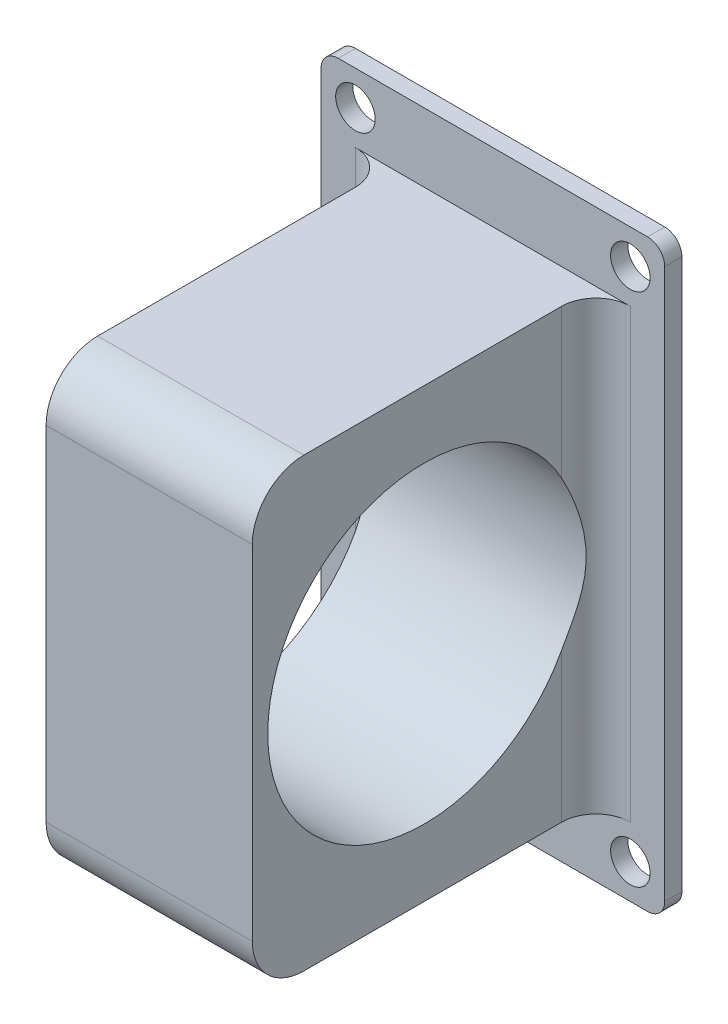
ISO-10303-21;
HEADER;
FILE_DESCRIPTION(('STEP AP214'),'2;1');
FILE_NAME('part.step','',(''),(''),'','','');
FILE_SCHEMA(('AUTOMOTIVE_DESIGN { 1 0 10303 214 1 1 1 1 }'));
ENDSEC;
DATA;
#1=APPLICATION_CONTEXT('core data for automotive mechanical design processes');
#2=APPLICATION_PROTOCOL_DEFINITION('international standard','automotive_design',2000,#1);
#3=PRODUCT_CONTEXT('',#1,'mechanical');
#4=PRODUCT('Part','Part','',(#3));
#5=PRODUCT_RELATED_PRODUCT_CATEGORY('part','',(#4));
#6=PRODUCT_DEFINITION_FORMATION('','',#4);
#7=PRODUCT_DEFINITION_CONTEXT('part definition',#1,'design');
#8=PRODUCT_DEFINITION('design','',#6,#7);
#9=PRODUCT_DEFINITION_SHAPE('','',#8);
#10=(LENGTH_UNIT() NAMED_UNIT(*) SI_UNIT(.MILLI.,.METRE.));
#11=(NAMED_UNIT(*) PLANE_ANGLE_UNIT() SI_UNIT($,.RADIAN.));
#12=(NAMED_UNIT(*) SI_UNIT($,.STERADIAN.) SOLID_ANGLE_UNIT());
#13=UNCERTAINTY_MEASURE_WITH_UNIT(LENGTH_MEASURE(1.E-05),#10,'distance_accuracy_value','');
#14=(GEOMETRIC_REPRESENTATION_CONTEXT(3) GLOBAL_UNCERTAINTY_ASSIGNED_CONTEXT((#13)) GLOBAL_UNIT_ASSIGNED_CONTEXT((#10,
#11,#12)) REPRESENTATION_CONTEXT('',''));
#15=CARTESIAN_POINT('',(0.,0.,0.));
#16=DIRECTION('',(0.,0.,1.));
#17=DIRECTION('',(1.,0.,0.));
#18=AXIS2_PLACEMENT_3D('',#15,#16,#17);
#19=CARTESIAN_POINT('',(18.,30.,3.));
#20=DIRECTION('',(0.,-1.,0.));
#21=DIRECTION('',(0.,0.,-1.));
#22=AXIS2_PLACEMENT_3D('',#19,#20,#21);
#23=CYLINDRICAL_SURFACE('',#22,2.);
#24=CARTESIAN_POINT('',(16.,12.6629503115597,3.));
#25=CARTESIAN_POINT('',(16.0000144522208,12.7630019777394,2.94575571250081));
#26=CARTESIAN_POINT('',(16.0022059738573,12.8640473267044,2.89340751273417));
#27=CARTESIAN_POINT('',(16.0101364377618,13.067875181605,2.79260690424727));
#28=CARTESIAN_POINT('',(16.0158738105553,13.1706568994177,2.74415278263614));
#29=CARTESIAN_POINT('',(16.0300797199414,13.3776362366392,2.65126758298738));
#30=CARTESIAN_POINT('',(16.0385440257983,13.481831424782,2.60683040868298));
#31=CARTESIAN_POINT('',(16.0574908617126,13.6916530758971,2.52193116202775));
#32=CARTESIAN_POINT('',(16.0679736341089,13.797279709313,2.48146956787045));
#33=CARTESIAN_POINT('',(16.1015203108123,14.117022182519,2.36576786055967));
#34=CARTESIAN_POINT('',(16.1266129770336,14.3331491111001,2.29659269839942));
#35=CARTESIAN_POINT('',(16.1770930546744,14.7700059796201,2.17454795579504));
#36=CARTESIAN_POINT('',(16.2024806074436,14.9907381711036,2.12168656063056));
#37=CARTESIAN_POINT('',(16.2500242499362,15.4473427956457,2.03026414945742));
#38=CARTESIAN_POINT('',(16.2719506296619,15.6834146780824,1.99256612925369));
#39=CARTESIAN_POINT('',(16.3062793617522,16.1584397147213,1.93584269665291));
#40=CARTESIAN_POINT('',(16.3186851901637,16.3973917849421,1.91681046848539));
#41=CARTESIAN_POINT('',(16.3311378402413,16.8757041782281,1.89771150387657));
#42=CARTESIAN_POINT('',(16.331220492279,17.1150612940937,1.89758978395936));
#43=CARTESIAN_POINT('',(16.3190942876016,17.5927364002971,1.91617854404325));
#44=CARTESIAN_POINT('',(16.3068839417851,17.8310542612331,1.93489130554261));
#45=CARTESIAN_POINT('',(16.2740253886458,18.2897957573625,1.98909647535908));
#46=CARTESIAN_POINT('',(16.2539585236051,18.5103992674159,2.02345501252474));
#47=CARTESIAN_POINT('',(16.2092147946582,18.9480497885023,2.10816145313518));
#48=CARTESIAN_POINT('',(16.1845372473773,19.1650962671343,2.15851172757879));
#49=CARTESIAN_POINT('',(16.1349770328418,19.5948330406112,2.27495551886073));
#50=CARTESIAN_POINT('',(16.1100944144303,19.8075243329732,2.34104538587422));
#51=CARTESIAN_POINT('',(16.0648856035647,20.2279021577973,2.48881695875643));
#52=CARTESIAN_POINT('',(16.0445577345568,20.4355905065823,2.57049290699127));
#53=CARTESIAN_POINT('',(16.0203736808988,20.7566729517306,2.71063687964885));
#54=CARTESIAN_POINT('',(16.013194713898,20.8720963584433,2.7639179856273));
#55=CARTESIAN_POINT('',(16.0031062358078,21.1007199391889,2.87533018913377));
#56=CARTESIAN_POINT('',(16.0001947361401,21.2139211244669,2.93345901433931));
#57=CARTESIAN_POINT('',(15.9998230784852,21.4381149301581,3.05459943885667));
#58=CARTESIAN_POINT('',(16.0023776221151,21.549100781923,3.11762376594705));
#59=CARTESIAN_POINT('',(16.0143840151863,21.7681892598793,3.24817953320271));
#60=CARTESIAN_POINT('',(16.0238449277007,21.8762879038462,3.31571678968435));
#61=CARTESIAN_POINT('',(16.0374664804089,21.9826162158239,3.38530790866706));
#62=B_SPLINE_CURVE_WITH_KNOTS('',3,(#24,#25,#26,#27,#28,#29,#30,#31,#32,#33,#34,#35,#36,#37,#38,
#39,#40,#41,#42,#43,#44,#45,#46,#47,#48,#49,#50,#51,#52,#53,#54,#55,#56,#57,#58,#59,#60,#61),
.UNSPECIFIED.,.F.,.F.,(4,2,2,2,2,2,2,2,2,2,2,2,2,2,2,2,2,2,4),(0.,0.341346781972085,
0.68254258419387,1.02321156256725,1.36392146749279,2.04814069523302,2.73270266750771,
3.45204457484511,4.17112371825762,4.88811205520666,5.60518725435841,6.27699371097789,
6.94889981883875,7.62065027109015,8.29215305158388,8.67399175494975,9.0556524703482,
9.43834100077486,9.82153262962585),.UNSPECIFIED.);
#63=CARTESIAN_POINT('',(16.,12.6629503115597,3.));
#64=VERTEX_POINT('',#63);
#65=CARTESIAN_POINT('',(16.,21.3370496884403,3.));
#66=VERTEX_POINT('',#65);
#67=EDGE_CURVE('E464',#64,#66,#62,.T.);
#68=ORIENTED_EDGE('',*,*,#67,.F.);
#69=DIRECTION('',(0.,1.,0.));
#70=VECTOR('',#69,1.);
#71=CARTESIAN_POINT('',(16.,30.,3.));
#72=LINE('',#71,#70);
#73=CARTESIAN_POINT('',(16.,4.,3.));
#74=VERTEX_POINT('',#73);
#75=EDGE_CURVE('E466',#74,#64,#72,.T.);
#76=ORIENTED_EDGE('',*,*,#75,.F.);
#77=CARTESIAN_POINT('',(18.,4.,3.));
#78=DIRECTION('',(0.,1.,0.));
#79=DIRECTION('',(0.,0.,1.));
#80=AXIS2_PLACEMENT_3D('',#77,#78,#79);
#81=CIRCLE('',#80,2.);
#82=CARTESIAN_POINT('',(18.,4.,0.999999999999999));
#83=VERTEX_POINT('',#82);
#84=EDGE_CURVE('E53',#74,#83,#81,.F.);
#85=ORIENTED_EDGE('',*,*,#84,.T.);
#86=DIRECTION('',(0.,1.,0.));
#87=VECTOR('',#86,1.);
#88=CARTESIAN_POINT('',(18.,30.,1.));
#89=LINE('',#88,#87);
#90=CARTESIAN_POINT('',(18.,30.,1.));
#91=VERTEX_POINT('',#90);
#92=EDGE_CURVE('E472',#91,#83,#89,.F.);
#93=ORIENTED_EDGE('',*,*,#92,.F.);
#94=CARTESIAN_POINT('',(18.,30.,3.));
#95=DIRECTION('',(0.,-1.,0.));
#96=DIRECTION('',(0.,0.,-1.));
#97=AXIS2_PLACEMENT_3D('',#94,#95,#96);
#98=CIRCLE('',#97,2.);
#99=CARTESIAN_POINT('',(16.,30.,3.));
#100=VERTEX_POINT('',#99);
#101=EDGE_CURVE('E11',#91,#100,#98,.F.);
#102=ORIENTED_EDGE('',*,*,#101,.T.);
#103=DIRECTION('',(0.,1.,0.));
#104=VECTOR('',#103,1.);
#105=CARTESIAN_POINT('',(16.,30.,3.));
#106=LINE('',#105,#104);
#107=EDGE_CURVE('E468',#66,#100,#106,.T.);
#108=ORIENTED_EDGE('',*,*,#107,.F.);
#109=EDGE_LOOP('',(#68,#76,#85,#93,#102,#108));
#110=FACE_BOUND('',#109,.T.);
#111=ADVANCED_FACE('F44',(#110),#23,.F.);
#112=CARTESIAN_POINT('',(2.,30.,3.));
#113=DIRECTION('',(0.,1.,0.));
#114=DIRECTION('',(0.,0.,1.));
#115=AXIS2_PLACEMENT_3D('',#112,#113,#114);
#116=CYLINDRICAL_SURFACE('',#115,2.);
#117=CARTESIAN_POINT('',(4.,21.3370496884403,3.));
#118=CARTESIAN_POINT('',(3.99998554777925,21.2369980222606,2.94575571250081));
#119=CARTESIAN_POINT('',(3.9977940261427,21.1359526732956,2.89340751273417));
#120=CARTESIAN_POINT('',(3.98986356223822,20.932124818395,2.79260690424727));
#121=CARTESIAN_POINT('',(3.98412618944466,20.8293431005823,2.74415278263614));
#122=CARTESIAN_POINT('',(3.96992028005856,20.6223637633608,2.65126758298738));
#123=CARTESIAN_POINT('',(3.96145597420168,20.518168575218,2.60683040868299));
#124=CARTESIAN_POINT('',(3.94250913828741,20.3083469241029,2.52193116202775));
#125=CARTESIAN_POINT('',(3.93202636589114,20.202720290687,2.48146956787045));
#126=CARTESIAN_POINT('',(3.89847968918768,19.882977817481,2.36576786055967));
#127=CARTESIAN_POINT('',(3.87338702296642,19.6668508888999,2.29659269839942));
#128=CARTESIAN_POINT('',(3.82290694532558,19.2299940203799,2.17454795579505));
#129=CARTESIAN_POINT('',(3.79751939255637,19.0092618288965,2.12168656063056));
#130=CARTESIAN_POINT('',(3.74997575006376,18.5526572043543,2.03026414945742));
#131=CARTESIAN_POINT('',(3.72804937033807,18.3165853219176,1.99256612925369));
#132=CARTESIAN_POINT('',(3.69372063824782,17.8415602852787,1.93584269665291));
#133=CARTESIAN_POINT('',(3.68131480983631,17.6026082150579,1.91681046848539));
#134=CARTESIAN_POINT('',(3.66886215975868,17.1242958217719,1.89771150387657));
#135=CARTESIAN_POINT('',(3.66877950772101,16.8849387059063,1.89758978395937));
#136=CARTESIAN_POINT('',(3.68090571239839,16.4072635997029,1.91617854404325));
#137=CARTESIAN_POINT('',(3.69311605821492,16.1689457387669,1.93489130554261));
#138=CARTESIAN_POINT('',(3.72597461135416,15.7102042426376,1.98909647535908));
#139=CARTESIAN_POINT('',(3.74604147639486,15.4896007325841,2.02345501252474));
#140=CARTESIAN_POINT('',(3.7907852053418,15.0519502114977,2.10816145313518));
#141=CARTESIAN_POINT('',(3.81546275262267,14.8349037328657,2.15851172757879));
#142=CARTESIAN_POINT('',(3.86502296715816,14.4051669593888,2.27495551886073));
#143=CARTESIAN_POINT('',(3.88990558556975,14.1924756670268,2.34104538587422));
#144=CARTESIAN_POINT('',(3.93511439643531,13.7720978422027,2.48881695875644));
#145=CARTESIAN_POINT('',(3.95544226544322,13.5644094934177,2.57049290699127));
#146=CARTESIAN_POINT('',(3.97962631910124,13.2433270482694,2.71063687964885));
#147=CARTESIAN_POINT('',(3.98680528610199,13.1279036415568,2.7639179856273));
#148=CARTESIAN_POINT('',(3.99689376419217,12.8992800608111,2.87533018913377));
#149=CARTESIAN_POINT('',(3.99980526385993,12.7860788755332,2.93345901433931));
#150=CARTESIAN_POINT('',(4.00017692151481,12.5618850698419,3.05459943885667));
#151=CARTESIAN_POINT('',(3.99762237788489,12.450899218077,3.11762376594705));
#152=CARTESIAN_POINT('',(3.98561598481371,12.2318107401207,3.24817953320271));
#153=CARTESIAN_POINT('',(3.97615507229935,12.1237120961538,3.31571678968435));
#154=CARTESIAN_POINT('',(3.9625335195911,12.0173837841761,3.38530790866706));
#155=B_SPLINE_CURVE_WITH_KNOTS('',3,(#117,#118,#119,#120,#121,#122,#123,#124,#125,#126,#127,
#128,#129,#130,#131,#132,#133,#134,#135,#136,#137,#138,#139,#140,#141,#142,#143,#144,#145,#146,
#147,#148,#149,#150,#151,#152,#153,#154),.UNSPECIFIED.,.F.,.F.,(4,2,2,2,2,2,2,2,2,2,2,2,2,2,2,2,
2,2,4),(0.,0.341346781972083,0.682542584193871,1.02321156256725,1.36392146749279,
2.04814069523302,2.73270266750771,3.45204457484511,4.17112371825763,4.88811205520666,
5.60518725435842,6.27699371097791,6.94889981883876,7.62065027109016,8.29215305158388,
8.67399175494975,9.05565247034819,9.43834100077485,9.82153262962584),.UNSPECIFIED.);
#156=CARTESIAN_POINT('',(4.,21.3370496884403,3.));
#157=VERTEX_POINT('',#156);
#158=CARTESIAN_POINT('',(4.,12.6629503115597,3.));
#159=VERTEX_POINT('',#158);
#160=EDGE_CURVE('E362',#157,#159,#155,.T.);
#161=ORIENTED_EDGE('',*,*,#160,.F.);
#162=DIRECTION('',(0.,-1.,0.));
#163=VECTOR('',#162,1.);
#164=CARTESIAN_POINT('',(4.,30.,3.));
#165=LINE('',#164,#163);
#166=CARTESIAN_POINT('',(4.,30.,3.));
#167=VERTEX_POINT('',#166);
#168=EDGE_CURVE('E356',#167,#157,#165,.T.);
#169=ORIENTED_EDGE('',*,*,#168,.F.);
#170=CARTESIAN_POINT('',(2.,30.,3.));
#171=DIRECTION('',(0.,-1.,0.));
#172=DIRECTION('',(0.,0.,-1.));
#173=AXIS2_PLACEMENT_3D('',#170,#171,#172);
#174=CIRCLE('',#173,2.);
#175=CARTESIAN_POINT('',(2.,30.,0.999999999999999));
#176=VERTEX_POINT('',#175);
#177=EDGE_CURVE('E197',#167,#176,#174,.F.);
#178=ORIENTED_EDGE('',*,*,#177,.T.);
#179=DIRECTION('',(0.,-1.,0.));
#180=VECTOR('',#179,1.);
#181=CARTESIAN_POINT('',(2.,30.,1.));
#182=LINE('',#181,#180);
#183=CARTESIAN_POINT('',(2.,4.,1.));
#184=VERTEX_POINT('',#183);
#185=EDGE_CURVE('E359',#184,#176,#182,.F.);
#186=ORIENTED_EDGE('',*,*,#185,.F.);
#187=CARTESIAN_POINT('',(2.,4.,3.));
#188=DIRECTION('',(0.,1.,0.));
#189=DIRECTION('',(0.,0.,1.));
#190=AXIS2_PLACEMENT_3D('',#187,#188,#189);
#191=CIRCLE('',#190,2.);
#192=CARTESIAN_POINT('',(4.,4.,3.));
#193=VERTEX_POINT('',#192);
#194=EDGE_CURVE('E492',#184,#193,#191,.F.);
#195=ORIENTED_EDGE('',*,*,#194,.T.);
#196=DIRECTION('',(0.,-1.,0.));
#197=VECTOR('',#196,1.);
#198=CARTESIAN_POINT('',(4.,30.,3.));
#199=LINE('',#198,#197);
#200=EDGE_CURVE('E352',#159,#193,#199,.T.);
#201=ORIENTED_EDGE('',*,*,#200,.F.);
#202=EDGE_LOOP('',(#161,#169,#178,#186,#195,#201));
#203=FACE_BOUND('',#202,.T.);
#204=ADVANCED_FACE('F374',(#203),#116,.F.);
#205=CARTESIAN_POINT('',(19.,33.,1.));
#206=DIRECTION('',(0.,0.,1.));
#207=DIRECTION('',(1.,0.,0.));
#208=AXIS2_PLACEMENT_3D('',#205,#206,#207);
#209=CYLINDRICAL_SURFACE('',#208,1.);
#210=DIRECTION('',(0.,0.,1.));
#211=VECTOR('',#210,1.);
#212=CARTESIAN_POINT('',(20.,33.,1.));
#213=LINE('',#212,#211);
#214=CARTESIAN_POINT('',(20.,33.,0.));
#215=VERTEX_POINT('',#214);
#216=CARTESIAN_POINT('',(20.,33.,1.));
#217=VERTEX_POINT('',#216);
#218=EDGE_CURVE('E338',#215,#217,#213,.T.);
#219=ORIENTED_EDGE('',*,*,#218,.F.);
#220=CARTESIAN_POINT('',(19.,33.,0.));
#221=DIRECTION('',(0.,0.,-1.));
#222=DIRECTION('',(-1.,0.,0.));
#223=AXIS2_PLACEMENT_3D('',#220,#221,#222);
#224=CIRCLE('',#223,1.);
#225=CARTESIAN_POINT('',(19.,34.,0.));
#226=VERTEX_POINT('',#225);
#227=EDGE_CURVE('E346',#226,#215,#224,.T.);
#228=ORIENTED_EDGE('',*,*,#227,.F.);
#229=DIRECTION('',(0.,0.,1.));
#230=VECTOR('',#229,1.);
#231=CARTESIAN_POINT('',(19.,34.,1.));
#232=LINE('',#231,#230);
#233=CARTESIAN_POINT('',(19.,34.,1.));
#234=VERTEX_POINT('',#233);
#235=EDGE_CURVE('E342',#234,#226,#232,.F.);
#236=ORIENTED_EDGE('',*,*,#235,.F.);
#237=CARTESIAN_POINT('',(19.,33.,1.));
#238=DIRECTION('',(0.,0.,-1.));
#239=DIRECTION('',(-1.,0.,0.));
#240=AXIS2_PLACEMENT_3D('',#237,#238,#239);
#241=CIRCLE('',#240,1.);
#242=EDGE_CURVE('E349',#217,#234,#241,.F.);
#243=ORIENTED_EDGE('',*,*,#242,.F.);
#244=EDGE_LOOP('',(#219,#228,#236,#243));
#245=FACE_BOUND('',#244,.T.);
#246=ADVANCED_FACE('F378',(#245),#209,.T.);
#247=CARTESIAN_POINT('',(1.,33.,1.));
#248=DIRECTION('',(0.,0.,-1.));
#249=DIRECTION('',(-1.,0.,0.));
#250=AXIS2_PLACEMENT_3D('',#247,#248,#249);
#251=CYLINDRICAL_SURFACE('',#250,1.);
#252=DIRECTION('',(0.,0.,-1.));
#253=VECTOR('',#252,1.);
#254=CARTESIAN_POINT('',(0.,33.,1.));
#255=LINE('',#254,#253);
#256=CARTESIAN_POINT('',(0.,33.,1.));
#257=VERTEX_POINT('',#256);
#258=CARTESIAN_POINT('',(0.,33.,0.));
#259=VERTEX_POINT('',#258);
#260=EDGE_CURVE('E323',#257,#259,#255,.T.);
#261=ORIENTED_EDGE('',*,*,#260,.F.);
#262=CARTESIAN_POINT('',(1.,33.,1.));
#263=DIRECTION('',(0.,0.,-1.));
#264=DIRECTION('',(-1.,0.,0.));
#265=AXIS2_PLACEMENT_3D('',#262,#263,#264);
#266=CIRCLE('',#265,1.);
#267=CARTESIAN_POINT('',(1.,34.,1.));
#268=VERTEX_POINT('',#267);
#269=EDGE_CURVE('E331',#268,#257,#266,.F.);
#270=ORIENTED_EDGE('',*,*,#269,.F.);
#271=DIRECTION('',(0.,0.,-1.));
#272=VECTOR('',#271,1.);
#273=CARTESIAN_POINT('',(1.,34.,1.));
#274=LINE('',#273,#272);
#275=CARTESIAN_POINT('',(1.,34.,0.));
#276=VERTEX_POINT('',#275);
#277=EDGE_CURVE('E327',#276,#268,#274,.F.);
#278=ORIENTED_EDGE('',*,*,#277,.F.);
#279=CARTESIAN_POINT('',(1.,33.,0.));
#280=DIRECTION('',(0.,0.,-1.));
#281=DIRECTION('',(-1.,0.,0.));
#282=AXIS2_PLACEMENT_3D('',#279,#280,#281);
#283=CIRCLE('',#282,1.);
#284=EDGE_CURVE('E334',#259,#276,#283,.T.);
#285=ORIENTED_EDGE('',*,*,#284,.F.);
#286=EDGE_LOOP('',(#261,#270,#278,#285));
#287=FACE_BOUND('',#286,.T.);
#288=ADVANCED_FACE('F382',(#287),#251,.T.);
#289=CARTESIAN_POINT('',(1.,1.,1.));
#290=DIRECTION('',(0.,0.,1.));
#291=DIRECTION('',(1.,0.,0.));
#292=AXIS2_PLACEMENT_3D('',#289,#290,#291);
#293=CYLINDRICAL_SURFACE('',#292,1.);
#294=DIRECTION('',(0.,0.,1.));
#295=VECTOR('',#294,1.);
#296=CARTESIAN_POINT('',(0.,1.,1.));
#297=LINE('',#296,#295);
#298=CARTESIAN_POINT('',(0.,1.,0.));
#299=VERTEX_POINT('',#298);
#300=CARTESIAN_POINT('',(0.,1.,1.));
#301=VERTEX_POINT('',#300);
#302=EDGE_CURVE('E308',#299,#301,#297,.T.);
#303=ORIENTED_EDGE('',*,*,#302,.F.);
#304=CARTESIAN_POINT('',(1.,1.,0.));
#305=DIRECTION('',(0.,0.,-1.));
#306=DIRECTION('',(-1.,0.,0.));
#307=AXIS2_PLACEMENT_3D('',#304,#305,#306);
#308=CIRCLE('',#307,1.);
#309=CARTESIAN_POINT('',(1.,0.,0.));
#310=VERTEX_POINT('',#309);
#311=EDGE_CURVE('E316',#310,#299,#308,.T.);
#312=ORIENTED_EDGE('',*,*,#311,.F.);
#313=DIRECTION('',(0.,0.,1.));
#314=VECTOR('',#313,1.);
#315=CARTESIAN_POINT('',(1.,0.,1.));
#316=LINE('',#315,#314);
#317=CARTESIAN_POINT('',(1.,0.,1.));
#318=VERTEX_POINT('',#317);
#319=EDGE_CURVE('E312',#318,#310,#316,.F.);
#320=ORIENTED_EDGE('',*,*,#319,.F.);
#321=CARTESIAN_POINT('',(1.,1.,1.));
#322=DIRECTION('',(0.,0.,-1.));
#323=DIRECTION('',(-1.,0.,0.));
#324=AXIS2_PLACEMENT_3D('',#321,#322,#323);
#325=CIRCLE('',#324,1.);
#326=EDGE_CURVE('E320',#301,#318,#325,.F.);
#327=ORIENTED_EDGE('',*,*,#326,.F.);
#328=EDGE_LOOP('',(#303,#312,#320,#327));
#329=FACE_BOUND('',#328,.T.);
#330=ADVANCED_FACE('F386',(#329),#293,.T.);
#331=CARTESIAN_POINT('',(19.,1.,1.));
#332=DIRECTION('',(0.,0.,1.));
#333=DIRECTION('',(1.,0.,0.));
#334=AXIS2_PLACEMENT_3D('',#331,#332,#333);
#335=CYLINDRICAL_SURFACE('',#334,1.);
#336=DIRECTION('',(0.,0.,1.));
#337=VECTOR('',#336,1.);
#338=CARTESIAN_POINT('',(19.,0.,1.));
#339=LINE('',#338,#337);
#340=CARTESIAN_POINT('',(19.,0.,0.));
#341=VERTEX_POINT('',#340);
#342=CARTESIAN_POINT('',(19.,0.,1.));
#343=VERTEX_POINT('',#342);
#344=EDGE_CURVE('E293',#341,#343,#339,.T.);
#345=ORIENTED_EDGE('',*,*,#344,.F.);
#346=CARTESIAN_POINT('',(19.,1.,0.));
#347=DIRECTION('',(0.,0.,-1.));
#348=DIRECTION('',(-1.,0.,0.));
#349=AXIS2_PLACEMENT_3D('',#346,#347,#348);
#350=CIRCLE('',#349,1.);
#351=CARTESIAN_POINT('',(20.,1.,0.));
#352=VERTEX_POINT('',#351);
#353=EDGE_CURVE('E301',#352,#341,#350,.T.);
#354=ORIENTED_EDGE('',*,*,#353,.F.);
#355=DIRECTION('',(0.,0.,1.));
#356=VECTOR('',#355,1.);
#357=CARTESIAN_POINT('',(20.,1.,1.));
#358=LINE('',#357,#356);
#359=CARTESIAN_POINT('',(20.,1.,1.));
#360=VERTEX_POINT('',#359);
#361=EDGE_CURVE('E297',#360,#352,#358,.F.);
#362=ORIENTED_EDGE('',*,*,#361,.F.);
#363=CARTESIAN_POINT('',(19.,1.,1.));
#364=DIRECTION('',(0.,0.,-1.));
#365=DIRECTION('',(-1.,0.,0.));
#366=AXIS2_PLACEMENT_3D('',#363,#364,#365);
#367=CIRCLE('',#366,1.);
#368=EDGE_CURVE('E305',#343,#360,#367,.F.);
#369=ORIENTED_EDGE('',*,*,#368,.F.);
#370=EDGE_LOOP('',(#345,#354,#362,#369));
#371=FACE_BOUND('',#370,.T.);
#372=ADVANCED_FACE('F390',(#371),#335,.T.);
#373=CARTESIAN_POINT('',(0.,7.,18.));
#374=DIRECTION('',(-1.,0.,0.));
#375=DIRECTION('',(0.,0.,1.));
#376=AXIS2_PLACEMENT_3D('',#373,#374,#375);
#377=CYLINDRICAL_SURFACE('',#376,3.);
#378=DIRECTION('',(1.,0.,0.));
#379=VECTOR('',#378,1.);
#380=CARTESIAN_POINT('',(0.,7.,21.));
#381=LINE('',#380,#379);
#382=CARTESIAN_POINT('',(4.,7.,21.));
#383=VERTEX_POINT('',#382);
#384=CARTESIAN_POINT('',(16.,7.,21.));
#385=VERTEX_POINT('',#384);
#386=EDGE_CURVE('E279',#383,#385,#381,.T.);
#387=ORIENTED_EDGE('',*,*,#386,.F.);
#388=CARTESIAN_POINT('',(4.,7.,18.));
#389=DIRECTION('',(1.,0.,0.));
#390=DIRECTION('',(0.,0.,-1.));
#391=AXIS2_PLACEMENT_3D('',#388,#389,#390);
#392=CIRCLE('',#391,3.);
#393=CARTESIAN_POINT('',(4.,4.,18.));
#394=VERTEX_POINT('',#393);
#395=EDGE_CURVE('E287',#394,#383,#392,.F.);
#396=ORIENTED_EDGE('',*,*,#395,.F.);
#397=DIRECTION('',(1.,0.,0.));
#398=VECTOR('',#397,1.);
#399=CARTESIAN_POINT('',(0.,4.,18.));
#400=LINE('',#399,#398);
#401=CARTESIAN_POINT('',(16.,4.,18.));
#402=VERTEX_POINT('',#401);
#403=EDGE_CURVE('E283',#402,#394,#400,.F.);
#404=ORIENTED_EDGE('',*,*,#403,.F.);
#405=CARTESIAN_POINT('',(16.,7.,18.));
#406=DIRECTION('',(-1.,0.,0.));
#407=DIRECTION('',(0.,0.,1.));
#408=AXIS2_PLACEMENT_3D('',#405,#406,#407);
#409=CIRCLE('',#408,3.);
#410=EDGE_CURVE('E290',#385,#402,#409,.F.);
#411=ORIENTED_EDGE('',*,*,#410,.F.);
#412=EDGE_LOOP('',(#387,#396,#404,#411));
#413=FACE_BOUND('',#412,.T.);
#414=ADVANCED_FACE('F394',(#413),#377,.T.);
#415=CARTESIAN_POINT('',(4.,27.,18.));
#416=DIRECTION('',(-1.,0.,0.));
#417=DIRECTION('',(0.,0.,1.));
#418=AXIS2_PLACEMENT_3D('',#415,#416,#417);
#419=CYLINDRICAL_SURFACE('',#418,3.);
#420=DIRECTION('',(1.,0.,0.));
#421=VECTOR('',#420,1.);
#422=CARTESIAN_POINT('',(4.,30.,18.));
#423=LINE('',#422,#421);
#424=CARTESIAN_POINT('',(4.,30.,18.));
#425=VERTEX_POINT('',#424);
#426=CARTESIAN_POINT('',(16.,30.,18.));
#427=VERTEX_POINT('',#426);
#428=EDGE_CURVE('E186',#425,#427,#423,.T.);
#429=ORIENTED_EDGE('',*,*,#428,.F.);
#430=CARTESIAN_POINT('',(4.,27.,18.));
#431=DIRECTION('',(1.,0.,0.));
#432=DIRECTION('',(0.,0.,-1.));
#433=AXIS2_PLACEMENT_3D('',#430,#431,#432);
#434=CIRCLE('',#433,3.);
#435=CARTESIAN_POINT('',(4.,27.,21.));
#436=VERTEX_POINT('',#435);
#437=EDGE_CURVE('E170',#436,#425,#434,.F.);
#438=ORIENTED_EDGE('',*,*,#437,.F.);
#439=DIRECTION('',(1.,0.,0.));
#440=VECTOR('',#439,1.);
#441=CARTESIAN_POINT('',(4.,27.,21.));
#442=LINE('',#441,#440);
#443=CARTESIAN_POINT('',(16.,27.,21.));
#444=VERTEX_POINT('',#443);
#445=EDGE_CURVE('E183',#444,#436,#442,.F.);
#446=ORIENTED_EDGE('',*,*,#445,.F.);
#447=CARTESIAN_POINT('',(16.,27.,18.));
#448=DIRECTION('',(-1.,0.,0.));
#449=DIRECTION('',(0.,0.,1.));
#450=AXIS2_PLACEMENT_3D('',#447,#448,#449);
#451=CIRCLE('',#450,3.);
#452=EDGE_CURVE('E182',#427,#444,#451,.F.);
#453=ORIENTED_EDGE('',*,*,#452,.F.);
#454=EDGE_LOOP('',(#429,#438,#446,#453));
#455=FACE_BOUND('',#454,.T.);
#456=ADVANCED_FACE('F187',(#455),#419,.T.);
#457=CARTESIAN_POINT('',(0.,0.,1.));
#458=DIRECTION('',(0.,0.,-1.));
#459=DIRECTION('',(-1.,0.,0.));
#460=AXIS2_PLACEMENT_3D('',#457,#458,#459);
#461=PLANE('',#460);
#462=CARTESIAN_POINT('',(18.,2.,1.));
#463=DIRECTION('',(0.,0.,1.));
#464=DIRECTION('',(1.,0.,0.));
#465=AXIS2_PLACEMENT_3D('',#462,#463,#464);
#466=CIRCLE('',#465,1.15);
#467=CARTESIAN_POINT('',(19.15,2.,1.));
#468=VERTEX_POINT('',#467);
#469=EDGE_CURVE('E219',#468,#468,#466,.T.);
#470=ORIENTED_EDGE('',*,*,#469,.F.);
#471=EDGE_LOOP('',(#470));
#472=FACE_BOUND('',#471,.T.);
#473=CARTESIAN_POINT('',(2.,2.,1.));
#474=DIRECTION('',(0.,0.,1.));
#475=DIRECTION('',(1.,0.,0.));
#476=AXIS2_PLACEMENT_3D('',#473,#474,#475);
#477=CIRCLE('',#476,1.15);
#478=CARTESIAN_POINT('',(3.15,2.,1.));
#479=VERTEX_POINT('',#478);
#480=EDGE_CURVE('E227',#479,#479,#477,.T.);
#481=ORIENTED_EDGE('',*,*,#480,.F.);
#482=EDGE_LOOP('',(#481));
#483=FACE_BOUND('',#482,.T.);
#484=CARTESIAN_POINT('',(18.,32.,1.));
#485=DIRECTION('',(0.,0.,1.));
#486=DIRECTION('',(1.,0.,0.));
#487=AXIS2_PLACEMENT_3D('',#484,#485,#486);
#488=CIRCLE('',#487,1.15);
#489=CARTESIAN_POINT('',(19.15,32.,1.));
#490=VERTEX_POINT('',#489);
#491=EDGE_CURVE('E235',#490,#490,#488,.T.);
#492=ORIENTED_EDGE('',*,*,#491,.F.);
#493=EDGE_LOOP('',(#492));
#494=FACE_BOUND('',#493,.T.);
#495=CARTESIAN_POINT('',(2.,32.,1.));
#496=DIRECTION('',(0.,0.,1.));
#497=DIRECTION('',(1.,0.,0.));
#498=AXIS2_PLACEMENT_3D('',#495,#496,#497);
#499=CIRCLE('',#498,1.15);
#500=CARTESIAN_POINT('',(3.15,32.,1.));
#501=VERTEX_POINT('',#500);
#502=EDGE_CURVE('E243',#501,#501,#499,.T.);
#503=ORIENTED_EDGE('',*,*,#502,.F.);
#504=EDGE_LOOP('',(#503));
#505=FACE_BOUND('',#504,.T.);
#506=DIRECTION('',(0.,1.,0.));
#507=VECTOR('',#506,1.);
#508=CARTESIAN_POINT('',(20.,0.,1.));
#509=LINE('',#508,#507);
#510=EDGE_CURVE('E258',#360,#217,#509,.T.);
#511=ORIENTED_EDGE('',*,*,#510,.T.);
#512=ORIENTED_EDGE('',*,*,#242,.T.);
#513=DIRECTION('',(-1.,0.,0.));
#514=VECTOR('',#513,1.);
#515=CARTESIAN_POINT('',(0.,34.,1.));
#516=LINE('',#515,#514);
#517=EDGE_CURVE('E193',#234,#268,#516,.T.);
#518=ORIENTED_EDGE('',*,*,#517,.T.);
#519=ORIENTED_EDGE('',*,*,#269,.T.);
#520=DIRECTION('',(0.,-1.,0.));
#521=VECTOR('',#520,1.);
#522=CARTESIAN_POINT('',(0.,0.,1.));
#523=LINE('',#522,#521);
#524=EDGE_CURVE('E251',#257,#301,#523,.T.);
#525=ORIENTED_EDGE('',*,*,#524,.T.);
#526=ORIENTED_EDGE('',*,*,#326,.T.);
#527=DIRECTION('',(1.,0.,0.));
#528=VECTOR('',#527,1.);
#529=CARTESIAN_POINT('',(0.,0.,1.));
#530=LINE('',#529,#528);
#531=EDGE_CURVE('E254',#318,#343,#530,.T.);
#532=ORIENTED_EDGE('',*,*,#531,.T.);
#533=ORIENTED_EDGE('',*,*,#368,.T.);
#534=EDGE_LOOP('',(#511,#512,#518,#519,#525,#526,#532,#533));
#535=FACE_BOUND('',#534,.T.);
#536=ORIENTED_EDGE('',*,*,#92,.T.);
#537=DIRECTION('',(1.,0.,0.));
#538=VECTOR('',#537,1.);
#539=CARTESIAN_POINT('',(4.,4.,1.));
#540=LINE('',#539,#538);
#541=EDGE_CURVE('E60',#184,#83,#540,.T.);
#542=ORIENTED_EDGE('',*,*,#541,.F.);
#543=ORIENTED_EDGE('',*,*,#185,.T.);
#544=DIRECTION('',(-1.,0.,0.));
#545=VECTOR('',#544,1.);
#546=CARTESIAN_POINT('',(4.,30.,1.));
#547=LINE('',#546,#545);
#548=EDGE_CURVE('E68',#91,#176,#547,.T.);
#549=ORIENTED_EDGE('',*,*,#548,.F.);
#550=EDGE_LOOP('',(#536,#542,#543,#549));
#551=FACE_BOUND('',#550,.T.);
#552=ADVANCED_FACE('F401',(#472,#483,#494,#505,#535,#551),#461,.F.);
#553=CARTESIAN_POINT('',(0.,0.,0.));
#554=DIRECTION('',(0.,0.,-1.));
#555=DIRECTION('',(-1.,0.,0.));
#556=AXIS2_PLACEMENT_3D('',#553,#554,#555);
#557=PLANE('',#556);
#558=CARTESIAN_POINT('',(2.,2.,0.));
#559=DIRECTION('',(0.,0.,1.));
#560=DIRECTION('',(1.,0.,0.));
#561=AXIS2_PLACEMENT_3D('',#558,#559,#560);
#562=CIRCLE('',#561,1.15);
#563=CARTESIAN_POINT('',(3.15,2.,0.));
#564=VERTEX_POINT('',#563);
#565=EDGE_CURVE('E223',#564,#564,#562,.T.);
#566=ORIENTED_EDGE('',*,*,#565,.T.);
#567=EDGE_LOOP('',(#566));
#568=FACE_BOUND('',#567,.T.);
#569=CARTESIAN_POINT('',(2.,32.,0.));
#570=DIRECTION('',(0.,0.,1.));
#571=DIRECTION('',(1.,0.,0.));
#572=AXIS2_PLACEMENT_3D('',#569,#570,#571);
#573=CIRCLE('',#572,1.15);
#574=CARTESIAN_POINT('',(3.15,32.,0.));
#575=VERTEX_POINT('',#574);
#576=EDGE_CURVE('E239',#575,#575,#573,.T.);
#577=ORIENTED_EDGE('',*,*,#576,.T.);
#578=EDGE_LOOP('',(#577));
#579=FACE_BOUND('',#578,.T.);
#580=DIRECTION('',(-1.,0.,0.));
#581=VECTOR('',#580,1.);
#582=CARTESIAN_POINT('',(0.,34.,0.));
#583=LINE('',#582,#581);
#584=EDGE_CURVE('E255',#226,#276,#583,.T.);
#585=ORIENTED_EDGE('',*,*,#584,.F.);
#586=ORIENTED_EDGE('',*,*,#227,.T.);
#587=DIRECTION('',(0.,1.,0.));
#588=VECTOR('',#587,1.);
#589=CARTESIAN_POINT('',(20.,0.,0.));
#590=LINE('',#589,#588);
#591=EDGE_CURVE('E269',#352,#215,#590,.T.);
#592=ORIENTED_EDGE('',*,*,#591,.F.);
#593=ORIENTED_EDGE('',*,*,#353,.T.);
#594=DIRECTION('',(1.,0.,0.));
#595=VECTOR('',#594,1.);
#596=CARTESIAN_POINT('',(0.,0.,0.));
#597=LINE('',#596,#595);
#598=EDGE_CURVE('E266',#310,#341,#597,.T.);
#599=ORIENTED_EDGE('',*,*,#598,.F.);
#600=ORIENTED_EDGE('',*,*,#311,.T.);
#601=DIRECTION('',(0.,-1.,0.));
#602=VECTOR('',#601,1.);
#603=CARTESIAN_POINT('',(0.,0.,0.));
#604=LINE('',#603,#602);
#605=EDGE_CURVE('E247',#259,#299,#604,.T.);
#606=ORIENTED_EDGE('',*,*,#605,.F.);
#607=ORIENTED_EDGE('',*,*,#284,.T.);
#608=EDGE_LOOP('',(#585,#586,#592,#593,#599,#600,#606,#607));
#609=FACE_BOUND('',#608,.T.);
#610=CARTESIAN_POINT('',(18.,32.,0.));
#611=DIRECTION('',(0.,0.,1.));
#612=DIRECTION('',(1.,0.,0.));
#613=AXIS2_PLACEMENT_3D('',#610,#611,#612);
#614=CIRCLE('',#613,1.15);
#615=CARTESIAN_POINT('',(19.15,32.,0.));
#616=VERTEX_POINT('',#615);
#617=EDGE_CURVE('E231',#616,#616,#614,.T.);
#618=ORIENTED_EDGE('',*,*,#617,.T.);
#619=EDGE_LOOP('',(#618));
#620=FACE_BOUND('',#619,.T.);
#621=CARTESIAN_POINT('',(18.,2.,0.));
#622=DIRECTION('',(0.,0.,1.));
#623=DIRECTION('',(1.,0.,0.));
#624=AXIS2_PLACEMENT_3D('',#621,#622,#623);
#625=CIRCLE('',#624,1.15);
#626=CARTESIAN_POINT('',(19.15,2.,0.));
#627=VERTEX_POINT('',#626);
#628=EDGE_CURVE('E218',#627,#627,#625,.T.);
#629=ORIENTED_EDGE('',*,*,#628,.T.);
#630=EDGE_LOOP('',(#629));
#631=FACE_BOUND('',#630,.T.);
#632=ADVANCED_FACE('F406',(#568,#579,#609,#620,#631),#557,.T.);
#633=CARTESIAN_POINT('',(0.,0.,1.));
#634=DIRECTION('',(1.,0.,0.));
#635=DIRECTION('',(0.,0.,-1.));
#636=AXIS2_PLACEMENT_3D('',#633,#634,#635);
#637=PLANE('',#636);
#638=ORIENTED_EDGE('',*,*,#524,.F.);
#639=ORIENTED_EDGE('',*,*,#260,.T.);
#640=ORIENTED_EDGE('',*,*,#605,.T.);
#641=ORIENTED_EDGE('',*,*,#302,.T.);
#642=EDGE_LOOP('',(#638,#639,#640,#641));
#643=FACE_BOUND('',#642,.T.);
#644=ADVANCED_FACE('F402',(#643),#637,.F.);
#645=CARTESIAN_POINT('',(0.,0.,1.));
#646=DIRECTION('',(0.,1.,0.));
#647=DIRECTION('',(0.,0.,1.));
#648=AXIS2_PLACEMENT_3D('',#645,#646,#647);
#649=PLANE('',#648);
#650=ORIENTED_EDGE('',*,*,#531,.F.);
#651=ORIENTED_EDGE('',*,*,#319,.T.);
#652=ORIENTED_EDGE('',*,*,#598,.T.);
#653=ORIENTED_EDGE('',*,*,#344,.T.);
#654=EDGE_LOOP('',(#650,#651,#652,#653));
#655=FACE_BOUND('',#654,.T.);
#656=ADVANCED_FACE('F405',(#655),#649,.F.);
#657=CARTESIAN_POINT('',(20.,0.,1.));
#658=DIRECTION('',(-1.,0.,0.));
#659=DIRECTION('',(0.,0.,1.));
#660=AXIS2_PLACEMENT_3D('',#657,#658,#659);
#661=PLANE('',#660);
#662=ORIENTED_EDGE('',*,*,#591,.T.);
#663=ORIENTED_EDGE('',*,*,#218,.T.);
#664=ORIENTED_EDGE('',*,*,#510,.F.);
#665=ORIENTED_EDGE('',*,*,#361,.T.);
#666=EDGE_LOOP('',(#662,#663,#664,#665));
#667=FACE_BOUND('',#666,.T.);
#668=ADVANCED_FACE('F410',(#667),#661,.F.);
#669=CARTESIAN_POINT('',(0.,34.,1.));
#670=DIRECTION('',(0.,-1.,0.));
#671=DIRECTION('',(0.,0.,-1.));
#672=AXIS2_PLACEMENT_3D('',#669,#670,#671);
#673=PLANE('',#672);
#674=ORIENTED_EDGE('',*,*,#517,.F.);
#675=ORIENTED_EDGE('',*,*,#235,.T.);
#676=ORIENTED_EDGE('',*,*,#584,.T.);
#677=ORIENTED_EDGE('',*,*,#277,.T.);
#678=EDGE_LOOP('',(#674,#675,#676,#677));
#679=FACE_BOUND('',#678,.T.);
#680=ADVANCED_FACE('F414',(#679),#673,.F.);
#681=CARTESIAN_POINT('',(2.,32.,1.));
#682=DIRECTION('',(0.,0.,-1.));
#683=DIRECTION('',(-1.,0.,0.));
#684=AXIS2_PLACEMENT_3D('',#681,#682,#683);
#685=CYLINDRICAL_SURFACE('',#684,1.15);
#686=ORIENTED_EDGE('',*,*,#502,.T.);
#687=EDGE_LOOP('',(#686));
#688=FACE_BOUND('',#687,.T.);
#689=ORIENTED_EDGE('',*,*,#576,.F.);
#690=EDGE_LOOP('',(#689));
#691=FACE_BOUND('',#690,.T.);
#692=ADVANCED_FACE('F418',(#688,#691),#685,.F.);
#693=CARTESIAN_POINT('',(18.,32.,1.));
#694=DIRECTION('',(0.,0.,-1.));
#695=DIRECTION('',(-1.,0.,0.));
#696=AXIS2_PLACEMENT_3D('',#693,#694,#695);
#697=CYLINDRICAL_SURFACE('',#696,1.15);
#698=ORIENTED_EDGE('',*,*,#491,.T.);
#699=EDGE_LOOP('',(#698));
#700=FACE_BOUND('',#699,.T.);
#701=ORIENTED_EDGE('',*,*,#617,.F.);
#702=EDGE_LOOP('',(#701));
#703=FACE_BOUND('',#702,.T.);
#704=ADVANCED_FACE('F428',(#700,#703),#697,.F.);
#705=CARTESIAN_POINT('',(2.,2.,1.));
#706=DIRECTION('',(0.,0.,-1.));
#707=DIRECTION('',(-1.,0.,0.));
#708=AXIS2_PLACEMENT_3D('',#705,#706,#707);
#709=CYLINDRICAL_SURFACE('',#708,1.15);
#710=ORIENTED_EDGE('',*,*,#480,.T.);
#711=EDGE_LOOP('',(#710));
#712=FACE_BOUND('',#711,.T.);
#713=ORIENTED_EDGE('',*,*,#565,.F.);
#714=EDGE_LOOP('',(#713));
#715=FACE_BOUND('',#714,.T.);
#716=ADVANCED_FACE('F432',(#712,#715),#709,.F.);
#717=CARTESIAN_POINT('',(18.,2.,1.));
#718=DIRECTION('',(0.,0.,-1.));
#719=DIRECTION('',(-1.,0.,0.));
#720=AXIS2_PLACEMENT_3D('',#717,#718,#719);
#721=CYLINDRICAL_SURFACE('',#720,1.15);
#722=ORIENTED_EDGE('',*,*,#469,.T.);
#723=EDGE_LOOP('',(#722));
#724=FACE_BOUND('',#723,.T.);
#725=ORIENTED_EDGE('',*,*,#628,.F.);
#726=EDGE_LOOP('',(#725));
#727=FACE_BOUND('',#726,.T.);
#728=ADVANCED_FACE('F436',(#724,#727),#721,.F.);
#729=CARTESIAN_POINT('',(4.,30.,21.));
#730=DIRECTION('',(1.,0.,0.));
#731=DIRECTION('',(0.,0.,-1.));
#732=AXIS2_PLACEMENT_3D('',#729,#730,#731);
#733=PLANE('',#732);
#734=DIRECTION('',(0.,0.,-1.));
#735=VECTOR('',#734,1.);
#736=CARTESIAN_POINT('',(4.,30.,21.));
#737=LINE('',#736,#735);
#738=EDGE_CURVE('E175',#425,#167,#737,.T.);
#739=ORIENTED_EDGE('',*,*,#738,.T.);
#740=ORIENTED_EDGE('',*,*,#168,.T.);
#741=CARTESIAN_POINT('',(4.,17.,11.));
#742=DIRECTION('',(1.,0.,0.));
#743=DIRECTION('',(0.,0.,-1.));
#744=AXIS2_PLACEMENT_3D('',#741,#742,#743);
#745=CIRCLE('',#744,9.1);
#746=EDGE_CURVE('E480',#157,#159,#745,.T.);
#747=ORIENTED_EDGE('',*,*,#746,.T.);
#748=ORIENTED_EDGE('',*,*,#200,.T.);
#749=DIRECTION('',(0.,0.,-1.));
#750=VECTOR('',#749,1.);
#751=CARTESIAN_POINT('',(4.,4.,21.));
#752=LINE('',#751,#750);
#753=EDGE_CURVE('E214',#394,#193,#752,.T.);
#754=ORIENTED_EDGE('',*,*,#753,.F.);
#755=ORIENTED_EDGE('',*,*,#395,.T.);
#756=DIRECTION('',(0.,-1.,0.));
#757=VECTOR('',#756,1.);
#758=CARTESIAN_POINT('',(4.,30.,21.));
#759=LINE('',#758,#757);
#760=EDGE_CURVE('E177',#436,#383,#759,.T.);
#761=ORIENTED_EDGE('',*,*,#760,.F.);
#762=ORIENTED_EDGE('',*,*,#437,.T.);
#763=EDGE_LOOP('',(#739,#740,#747,#748,#754,#755,#761,#762));
#764=FACE_BOUND('',#763,.T.);
#765=ADVANCED_FACE('F172',(#764),#733,.F.);
#766=CARTESIAN_POINT('',(4.,4.,21.));
#767=DIRECTION('',(0.,1.,0.));
#768=DIRECTION('',(0.,0.,1.));
#769=AXIS2_PLACEMENT_3D('',#766,#767,#768);
#770=PLANE('',#769);
#771=DIRECTION('',(0.,0.,-1.));
#772=VECTOR('',#771,1.);
#773=CARTESIAN_POINT('',(16.,4.,21.));
#774=LINE('',#773,#772);
#775=EDGE_CURVE('E205',#402,#74,#774,.T.);
#776=ORIENTED_EDGE('',*,*,#775,.F.);
#777=ORIENTED_EDGE('',*,*,#403,.T.);
#778=ORIENTED_EDGE('',*,*,#753,.T.);
#779=ORIENTED_EDGE('',*,*,#194,.F.);
#780=ORIENTED_EDGE('',*,*,#541,.T.);
#781=ORIENTED_EDGE('',*,*,#84,.F.);
#782=EDGE_LOOP('',(#776,#777,#778,#779,#780,#781));
#783=FACE_BOUND('',#782,.T.);
#784=ADVANCED_FACE('F443',(#783),#770,.F.);
#785=CARTESIAN_POINT('',(16.,30.,21.));
#786=DIRECTION('',(-1.,0.,0.));
#787=DIRECTION('',(0.,0.,1.));
#788=AXIS2_PLACEMENT_3D('',#785,#786,#787);
#789=PLANE('',#788);
#790=ORIENTED_EDGE('',*,*,#775,.T.);
#791=ORIENTED_EDGE('',*,*,#75,.T.);
#792=CARTESIAN_POINT('',(16.,17.,11.));
#793=DIRECTION('',(1.,0.,0.));
#794=DIRECTION('',(0.,0.,-1.));
#795=AXIS2_PLACEMENT_3D('',#792,#793,#794);
#796=CIRCLE('',#795,9.1);
#797=EDGE_CURVE('E474',#66,#64,#796,.T.);
#798=ORIENTED_EDGE('',*,*,#797,.F.);
#799=ORIENTED_EDGE('',*,*,#107,.T.);
#800=DIRECTION('',(0.,0.,-1.));
#801=VECTOR('',#800,1.);
#802=CARTESIAN_POINT('',(16.,30.,21.));
#803=LINE('',#802,#801);
#804=EDGE_CURVE('E200',#427,#100,#803,.T.);
#805=ORIENTED_EDGE('',*,*,#804,.F.);
#806=ORIENTED_EDGE('',*,*,#452,.T.);
#807=DIRECTION('',(0.,1.,0.));
#808=VECTOR('',#807,1.);
#809=CARTESIAN_POINT('',(16.,30.,21.));
#810=LINE('',#809,#808);
#811=EDGE_CURVE('E201',#385,#444,#810,.T.);
#812=ORIENTED_EDGE('',*,*,#811,.F.);
#813=ORIENTED_EDGE('',*,*,#410,.T.);
#814=EDGE_LOOP('',(#790,#791,#798,#799,#805,#806,#812,#813));
#815=FACE_BOUND('',#814,.T.);
#816=ADVANCED_FACE('F446',(#815),#789,.F.);
#817=CARTESIAN_POINT('',(4.,30.,21.));
#818=DIRECTION('',(0.,-1.,0.));
#819=DIRECTION('',(0.,0.,-1.));
#820=AXIS2_PLACEMENT_3D('',#817,#818,#819);
#821=PLANE('',#820);
#822=ORIENTED_EDGE('',*,*,#738,.F.);
#823=ORIENTED_EDGE('',*,*,#428,.T.);
#824=ORIENTED_EDGE('',*,*,#804,.T.);
#825=ORIENTED_EDGE('',*,*,#101,.F.);
#826=ORIENTED_EDGE('',*,*,#548,.T.);
#827=ORIENTED_EDGE('',*,*,#177,.F.);
#828=EDGE_LOOP('',(#822,#823,#824,#825,#826,#827));
#829=FACE_BOUND('',#828,.T.);
#830=ADVANCED_FACE('F195',(#829),#821,.F.);
#831=CARTESIAN_POINT('',(0.,0.,21.));
#832=DIRECTION('',(0.,0.,1.));
#833=DIRECTION('',(1.,0.,0.));
#834=AXIS2_PLACEMENT_3D('',#831,#832,#833);
#835=PLANE('',#834);
#836=ORIENTED_EDGE('',*,*,#760,.T.);
#837=ORIENTED_EDGE('',*,*,#386,.T.);
#838=ORIENTED_EDGE('',*,*,#811,.T.);
#839=ORIENTED_EDGE('',*,*,#445,.T.);
#840=EDGE_LOOP('',(#836,#837,#838,#839));
#841=FACE_BOUND('',#840,.T.);
#842=ADVANCED_FACE('F451',(#841),#835,.T.);
#843=CARTESIAN_POINT('',(0.,17.,11.));
#844=DIRECTION('',(1.,0.,0.));
#845=DIRECTION('',(0.,0.,-1.));
#846=AXIS2_PLACEMENT_3D('',#843,#844,#845);
#847=CYLINDRICAL_SURFACE('',#846,9.1);
#848=ORIENTED_EDGE('',*,*,#797,.T.);
#849=ORIENTED_EDGE('',*,*,#67,.T.);
#850=EDGE_LOOP('',(#848,#849));
#851=FACE_BOUND('',#850,.T.);
#852=ORIENTED_EDGE('',*,*,#746,.F.);
#853=ORIENTED_EDGE('',*,*,#160,.T.);
#854=EDGE_LOOP('',(#852,#853));
#855=FACE_BOUND('',#854,.T.);
#856=ADVANCED_FACE('F371',(#851,#855),#847,.F.);
#857=CLOSED_SHELL('',(#111,#204,#246,#288,#330,#372,#414,#456,#552,#632,#644,#656,#668,#680,
#692,#704,#716,#728,#765,#784,#816,#830,#842,#856));
#858=MANIFOLD_SOLID_BREP('B2',#857);
#859=ADVANCED_BREP_SHAPE_REPRESENTATION('',(#18,#858),#14);
#860=SHAPE_DEFINITION_REPRESENTATION(#9,#859);
ENDSEC;
END-ISO-10303-21;
